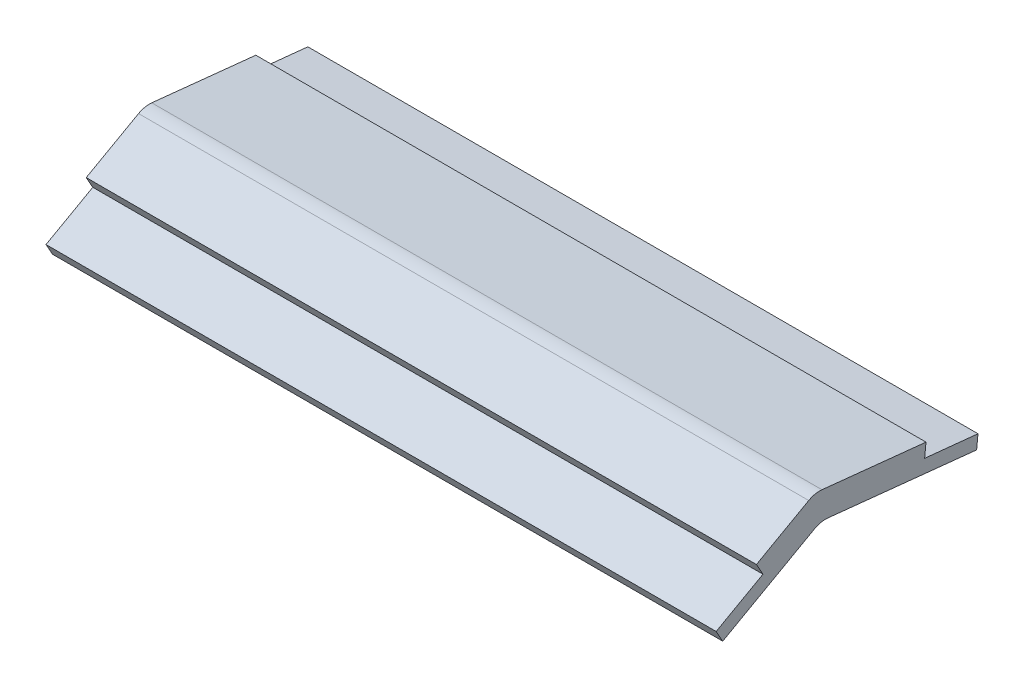
ISO-10303-21;
HEADER;
FILE_DESCRIPTION(('STEP AP214'),'2;1');
FILE_NAME('part.step','',(''),(''),'','','');
FILE_SCHEMA(('AUTOMOTIVE_DESIGN { 1 0 10303 214 1 1 1 1 }'));
ENDSEC;
DATA;
#1=APPLICATION_CONTEXT('core data for automotive mechanical design processes');
#2=APPLICATION_PROTOCOL_DEFINITION('international standard','automotive_design',2000,#1);
#3=PRODUCT_CONTEXT('',#1,'mechanical');
#4=PRODUCT('Part','Part','',(#3));
#5=PRODUCT_RELATED_PRODUCT_CATEGORY('part','',(#4));
#6=PRODUCT_DEFINITION_FORMATION('','',#4);
#7=PRODUCT_DEFINITION_CONTEXT('part definition',#1,'design');
#8=PRODUCT_DEFINITION('design','',#6,#7);
#9=PRODUCT_DEFINITION_SHAPE('','',#8);
#10=(LENGTH_UNIT() NAMED_UNIT(*) SI_UNIT(.MILLI.,.METRE.));
#11=(NAMED_UNIT(*) PLANE_ANGLE_UNIT() SI_UNIT($,.RADIAN.));
#12=(NAMED_UNIT(*) SI_UNIT($,.STERADIAN.) SOLID_ANGLE_UNIT());
#13=UNCERTAINTY_MEASURE_WITH_UNIT(LENGTH_MEASURE(1.E-05),#10,'distance_accuracy_value','');
#14=(GEOMETRIC_REPRESENTATION_CONTEXT(3) GLOBAL_UNCERTAINTY_ASSIGNED_CONTEXT((#13)) GLOBAL_UNIT_ASSIGNED_CONTEXT((#10,
#11,#12)) REPRESENTATION_CONTEXT('',''));
#15=CARTESIAN_POINT('',(0.,0.,0.));
#16=DIRECTION('',(0.,0.,1.));
#17=DIRECTION('',(1.,0.,0.));
#18=AXIS2_PLACEMENT_3D('',#15,#16,#17);
#19=CARTESIAN_POINT('',(150.,11.0948304798328,17.0451479877526));
#20=DIRECTION('',(0.,-0.872729204382896,-0.488204604461283));
#21=DIRECTION('',(0.,0.488204604461283,-0.872729204382896));
#22=AXIS2_PLACEMENT_3D('',#19,#20,#21);
#23=PLANE('',#22);
#24=DIRECTION('',(0.,-0.488204604461283,0.872729204382896));
#25=VECTOR('',#24,1.);
#26=CARTESIAN_POINT('',(0.,11.0948304798328,17.0451479877526));
#27=LINE('',#26,#25);
#28=CARTESIAN_POINT('',(0.,17.6447819354706,5.33625816903992));
#29=VERTEX_POINT('',#28);
#30=CARTESIAN_POINT('',(0.,11.0948304798328,17.0451479877526));
#31=VERTEX_POINT('',#30);
#32=EDGE_CURVE('E157',#29,#31,#27,.T.);
#33=ORIENTED_EDGE('',*,*,#32,.T.);
#34=DIRECTION('',(-1.,0.,0.));
#35=VECTOR('',#34,1.);
#36=CARTESIAN_POINT('',(150.,11.0948304798328,17.0451479877526));
#37=LINE('',#36,#35);
#38=CARTESIAN_POINT('',(150.,11.0948304798328,17.0451479877526));
#39=VERTEX_POINT('',#38);
#40=EDGE_CURVE('E11',#39,#31,#37,.T.);
#41=ORIENTED_EDGE('',*,*,#40,.F.);
#42=DIRECTION('',(0.,-0.488204604461283,0.872729204382896));
#43=VECTOR('',#42,1.);
#44=CARTESIAN_POINT('',(150.,11.0948304798328,17.0451479877526));
#45=LINE('',#44,#43);
#46=CARTESIAN_POINT('',(150.,17.6447819354706,5.33625816903992));
#47=VERTEX_POINT('',#46);
#48=EDGE_CURVE('E179',#47,#39,#45,.T.);
#49=ORIENTED_EDGE('',*,*,#48,.F.);
#50=DIRECTION('',(-1.,0.,0.));
#51=VECTOR('',#50,1.);
#52=CARTESIAN_POINT('',(150.,17.6447819354706,5.33625816903992));
#53=LINE('',#52,#51);
#54=EDGE_CURVE('E153',#47,#29,#53,.T.);
#55=ORIENTED_EDGE('',*,*,#54,.T.);
#56=EDGE_LOOP('',(#33,#41,#49,#55));
#57=FACE_BOUND('',#56,.T.);
#58=ADVANCED_FACE('F37',(#57),#23,.F.);
#59=CARTESIAN_POINT('',(150.,11.0948304798328,17.0451479877526));
#60=DIRECTION('',(0.,0.488204604461283,-0.872729204382896));
#61=DIRECTION('',(0.,0.872729204382896,0.488204604461283));
#62=AXIS2_PLACEMENT_3D('',#59,#60,#61);
#63=PLANE('',#62);
#64=DIRECTION('',(0.,-0.872729204382896,-0.488204604461283));
#65=VECTOR('',#64,1.);
#66=CARTESIAN_POINT('',(0.,11.0948304798328,17.0451479877526));
#67=LINE('',#66,#65);
#68=CARTESIAN_POINT('',(0.,8.47664286668409,15.5805341743687));
#69=VERTEX_POINT('',#68);
#70=EDGE_CURVE('E160',#31,#69,#67,.T.);
#71=ORIENTED_EDGE('',*,*,#70,.T.);
#72=DIRECTION('',(-1.,0.,0.));
#73=VECTOR('',#72,1.);
#74=CARTESIAN_POINT('',(150.,8.47664286668409,15.5805341743687));
#75=LINE('',#74,#73);
#76=CARTESIAN_POINT('',(150.,8.47664286668409,15.5805341743687));
#77=VERTEX_POINT('',#76);
#78=EDGE_CURVE('E45',#77,#69,#75,.T.);
#79=ORIENTED_EDGE('',*,*,#78,.F.);
#80=DIRECTION('',(0.,-0.872729204382896,-0.488204604461283));
#81=VECTOR('',#80,1.);
#82=CARTESIAN_POINT('',(150.,11.0948304798328,17.0451479877526));
#83=LINE('',#82,#81);
#84=EDGE_CURVE('E108',#39,#77,#83,.T.);
#85=ORIENTED_EDGE('',*,*,#84,.F.);
#86=ORIENTED_EDGE('',*,*,#40,.T.);
#87=EDGE_LOOP('',(#71,#79,#85,#86));
#88=FACE_BOUND('',#87,.T.);
#89=ADVANCED_FACE('F257',(#88),#63,.F.);
#90=CARTESIAN_POINT('',(150.,8.47664286668409,15.5805341743687));
#91=DIRECTION('',(0.,-0.872729204382896,-0.488204604461283));
#92=DIRECTION('',(0.,0.488204604461283,-0.872729204382896));
#93=AXIS2_PLACEMENT_3D('',#90,#91,#92);
#94=PLANE('',#93);
#95=DIRECTION('',(0.,-0.488204604461283,0.872729204382896));
#96=VECTOR('',#95,1.);
#97=CARTESIAN_POINT('',(0.,8.47664286668409,15.5805341743687));
#98=LINE('',#97,#96);
#99=CARTESIAN_POINT('',(0.,2.61818761314869,26.0532846269635));
#100=VERTEX_POINT('',#99);
#101=EDGE_CURVE('E162',#69,#100,#98,.T.);
#102=ORIENTED_EDGE('',*,*,#101,.T.);
#103=DIRECTION('',(-1.,0.,0.));
#104=VECTOR('',#103,1.);
#105=CARTESIAN_POINT('',(150.,2.61818761314869,26.0532846269635));
#106=LINE('',#105,#104);
#107=CARTESIAN_POINT('',(150.,2.61818761314869,26.0532846269635));
#108=VERTEX_POINT('',#107);
#109=EDGE_CURVE('E198',#108,#100,#106,.T.);
#110=ORIENTED_EDGE('',*,*,#109,.F.);
#111=DIRECTION('',(0.,-0.488204604461283,0.872729204382896));
#112=VECTOR('',#111,1.);
#113=CARTESIAN_POINT('',(150.,8.47664286668409,15.5805341743687));
#114=LINE('',#113,#112);
#115=EDGE_CURVE('E206',#77,#108,#114,.T.);
#116=ORIENTED_EDGE('',*,*,#115,.F.);
#117=ORIENTED_EDGE('',*,*,#78,.T.);
#118=EDGE_LOOP('',(#102,#110,#116,#117));
#119=FACE_BOUND('',#118,.T.);
#120=ADVANCED_FACE('F204',(#119),#94,.F.);
#121=CARTESIAN_POINT('',(150.,2.61818761314869,26.0532846269635));
#122=DIRECTION('',(0.,0.488204604461274,-0.872729204382901));
#123=DIRECTION('',(0.,0.872729204382901,0.488204604461274));
#124=AXIS2_PLACEMENT_3D('',#121,#122,#123);
#125=PLANE('',#124);
#126=DIRECTION('',(0.,-0.872729204382901,-0.488204604461274));
#127=VECTOR('',#126,1.);
#128=CARTESIAN_POINT('',(0.,2.61818761314869,26.0532846269635));
#129=LINE('',#128,#127);
#130=CARTESIAN_POINT('',(0.,0.,24.5886708135796));
#131=VERTEX_POINT('',#130);
#132=EDGE_CURVE('E164',#100,#131,#129,.T.);
#133=ORIENTED_EDGE('',*,*,#132,.T.);
#134=DIRECTION('',(-1.,0.,0.));
#135=VECTOR('',#134,1.);
#136=CARTESIAN_POINT('',(150.,0.,24.5886708135796));
#137=LINE('',#136,#135);
#138=CARTESIAN_POINT('',(150.,0.,24.5886708135796));
#139=VERTEX_POINT('',#138);
#140=EDGE_CURVE('E195',#139,#131,#137,.T.);
#141=ORIENTED_EDGE('',*,*,#140,.F.);
#142=DIRECTION('',(0.,-0.872729204382901,-0.488204604461274));
#143=VECTOR('',#142,1.);
#144=CARTESIAN_POINT('',(150.,2.61818761314869,26.0532846269635));
#145=LINE('',#144,#143);
#146=EDGE_CURVE('E224',#108,#139,#145,.T.);
#147=ORIENTED_EDGE('',*,*,#146,.F.);
#148=ORIENTED_EDGE('',*,*,#109,.T.);
#149=EDGE_LOOP('',(#133,#141,#147,#148));
#150=FACE_BOUND('',#149,.T.);
#151=ADVANCED_FACE('F215',(#150),#125,.F.);
#152=CARTESIAN_POINT('',(150.,0.,24.5886708135796));
#153=DIRECTION('',(0.,0.872729204382896,0.488204604461283));
#154=DIRECTION('',(0.,-0.488204604461283,0.872729204382896));
#155=AXIS2_PLACEMENT_3D('',#152,#153,#154);
#156=PLANE('',#155);
#157=DIRECTION('',(0.,0.488204604461283,-0.872729204382896));
#158=VECTOR('',#157,1.);
#159=CARTESIAN_POINT('',(0.,0.,24.5886708135796));
#160=LINE('',#159,#158);
#161=CARTESIAN_POINT('',(0.,11.5069491338813,4.01850316108857));
#162=VERTEX_POINT('',#161);
#163=EDGE_CURVE('E166',#131,#162,#160,.T.);
#164=ORIENTED_EDGE('',*,*,#163,.T.);
#165=DIRECTION('',(-1.,0.,0.));
#166=VECTOR('',#165,1.);
#167=CARTESIAN_POINT('',(150.,11.5069491338813,4.01850316108857));
#168=LINE('',#167,#166);
#169=CARTESIAN_POINT('',(150.,11.5069491338813,4.01850316108857));
#170=VERTEX_POINT('',#169);
#171=EDGE_CURVE('E192',#170,#162,#168,.T.);
#172=ORIENTED_EDGE('',*,*,#171,.F.);
#173=DIRECTION('',(0.,0.488204604461283,-0.872729204382896));
#174=VECTOR('',#173,1.);
#175=CARTESIAN_POINT('',(150.,0.,24.5886708135796));
#176=LINE('',#175,#174);
#177=EDGE_CURVE('E221',#139,#170,#176,.T.);
#178=ORIENTED_EDGE('',*,*,#177,.F.);
#179=ORIENTED_EDGE('',*,*,#140,.T.);
#180=EDGE_LOOP('',(#164,#172,#178,#179));
#181=FACE_BOUND('',#180,.T.);
#182=ADVANCED_FACE('F219',(#181),#156,.F.);
#183=CARTESIAN_POINT('',(150.,7.14330311196677,1.57748013878215));
#184=DIRECTION('',(-1.,0.,0.));
#185=DIRECTION('',(0.,0.,1.));
#186=AXIS2_PLACEMENT_3D('',#183,#184,#185);
#187=CYLINDRICAL_SURFACE('',#186,5.00000000000006);
#188=CARTESIAN_POINT('',(0.,7.14330311196677,1.57748013878215));
#189=DIRECTION('',(-1.,0.,0.));
#190=DIRECTION('',(0.,0.,-1.));
#191=AXIS2_PLACEMENT_3D('',#188,#189,#190);
#192=CIRCLE('',#191,5.00000000000006);
#193=CARTESIAN_POINT('',(0.,12.1165898361456,1.06132206308532));
#194=VERTEX_POINT('',#193);
#195=EDGE_CURVE('E168',#162,#194,#192,.T.);
#196=ORIENTED_EDGE('',*,*,#195,.T.);
#197=DIRECTION('',(-1.,0.,0.));
#198=VECTOR('',#197,1.);
#199=CARTESIAN_POINT('',(150.,12.1165898361456,1.06132206308532));
#200=LINE('',#199,#198);
#201=CARTESIAN_POINT('',(150.,12.1165898361456,1.06132206308532));
#202=VERTEX_POINT('',#201);
#203=EDGE_CURVE('E189',#202,#194,#200,.T.);
#204=ORIENTED_EDGE('',*,*,#203,.F.);
#205=CARTESIAN_POINT('',(150.,7.14330311196677,1.57748013878215));
#206=DIRECTION('',(-1.,0.,0.));
#207=DIRECTION('',(0.,0.,-1.));
#208=AXIS2_PLACEMENT_3D('',#205,#206,#207);
#209=CIRCLE('',#208,5.00000000000006);
#210=EDGE_CURVE('E223',#170,#202,#209,.T.);
#211=ORIENTED_EDGE('',*,*,#210,.F.);
#212=ORIENTED_EDGE('',*,*,#171,.T.);
#213=EDGE_LOOP('',(#196,#204,#211,#212));
#214=FACE_BOUND('',#213,.T.);
#215=ADVANCED_FACE('F270',(#214),#187,.F.);
#216=CARTESIAN_POINT('',(150.,12.1165898361456,1.06132206308532));
#217=DIRECTION('',(0.,0.994657344835757,-0.103231615139367));
#218=DIRECTION('',(0.,0.103231615139367,0.994657344835757));
#219=AXIS2_PLACEMENT_3D('',#216,#217,#218);
#220=PLANE('',#219);
#221=DIRECTION('',(0.,-0.103231615139367,-0.994657344835757));
#222=VECTOR('',#221,1.);
#223=CARTESIAN_POINT('',(0.,12.1165898361456,1.06132206308532));
#224=LINE('',#223,#222);
#225=CARTESIAN_POINT('',(0.,8.66041814032255,-32.2395863613621));
#226=VERTEX_POINT('',#225);
#227=EDGE_CURVE('E170',#194,#226,#224,.T.);
#228=ORIENTED_EDGE('',*,*,#227,.T.);
#229=DIRECTION('',(-1.,0.,0.));
#230=VECTOR('',#229,1.);
#231=CARTESIAN_POINT('',(150.,8.66041814032255,-32.2395863613621));
#232=LINE('',#231,#230);
#233=CARTESIAN_POINT('',(150.,8.66041814032255,-32.2395863613621));
#234=VERTEX_POINT('',#233);
#235=EDGE_CURVE('E186',#234,#226,#232,.T.);
#236=ORIENTED_EDGE('',*,*,#235,.F.);
#237=DIRECTION('',(0.,-0.103231615139367,-0.994657344835757));
#238=VECTOR('',#237,1.);
#239=CARTESIAN_POINT('',(150.,12.1165898361456,1.06132206308532));
#240=LINE('',#239,#238);
#241=EDGE_CURVE('E226',#202,#234,#240,.T.);
#242=ORIENTED_EDGE('',*,*,#241,.F.);
#243=ORIENTED_EDGE('',*,*,#203,.T.);
#244=EDGE_LOOP('',(#228,#236,#242,#243));
#245=FACE_BOUND('',#244,.T.);
#246=ADVANCED_FACE('F273',(#245),#220,.F.);
#247=CARTESIAN_POINT('',(150.,11.6443901748298,-32.5492812067802));
#248=DIRECTION('',(0.,0.103231615139368,0.994657344835757));
#249=DIRECTION('',(0.,-0.994657344835757,0.103231615139368));
#250=AXIS2_PLACEMENT_3D('',#247,#248,#249);
#251=PLANE('',#250);
#252=DIRECTION('',(0.,0.994657344835757,-0.103231615139368));
#253=VECTOR('',#252,1.);
#254=CARTESIAN_POINT('',(0.,11.6443901748298,-32.5492812067802));
#255=LINE('',#254,#253);
#256=CARTESIAN_POINT('',(0.,11.6443901748298,-32.5492812067802));
#257=VERTEX_POINT('',#256);
#258=EDGE_CURVE('E172',#226,#257,#255,.T.);
#259=ORIENTED_EDGE('',*,*,#258,.T.);
#260=DIRECTION('',(-1.,0.,0.));
#261=VECTOR('',#260,1.);
#262=CARTESIAN_POINT('',(150.,11.6443901748298,-32.5492812067802));
#263=LINE('',#262,#261);
#264=CARTESIAN_POINT('',(150.,11.6443901748298,-32.5492812067802));
#265=VERTEX_POINT('',#264);
#266=EDGE_CURVE('E183',#265,#257,#263,.T.);
#267=ORIENTED_EDGE('',*,*,#266,.F.);
#268=DIRECTION('',(0.,0.994657344835757,-0.103231615139368));
#269=VECTOR('',#268,1.);
#270=CARTESIAN_POINT('',(150.,11.6443901748298,-32.5492812067802));
#271=LINE('',#270,#269);
#272=EDGE_CURVE('E232',#234,#265,#271,.T.);
#273=ORIENTED_EDGE('',*,*,#272,.F.);
#274=ORIENTED_EDGE('',*,*,#235,.T.);
#275=EDGE_LOOP('',(#259,#267,#273,#274));
#276=FACE_BOUND('',#275,.T.);
#277=ADVANCED_FACE('F238',(#276),#251,.F.);
#278=CARTESIAN_POINT('',(150.,12.8523474609138,-20.6102343773638));
#279=DIRECTION('',(0.,-0.99492056911803,0.100663107173661));
#280=DIRECTION('',(0.,-0.100663107173661,-0.99492056911803));
#281=AXIS2_PLACEMENT_3D('',#278,#279,#280);
#282=PLANE('',#281);
#283=DIRECTION('',(0.,0.100663107173661,0.99492056911803));
#284=VECTOR('',#283,1.);
#285=CARTESIAN_POINT('',(0.,12.8523474609138,-20.6102343773638));
#286=LINE('',#285,#284);
#287=CARTESIAN_POINT('',(0.,12.8523474609138,-20.6102343773638));
#288=VERTEX_POINT('',#287);
#289=EDGE_CURVE('E174',#257,#288,#286,.T.);
#290=ORIENTED_EDGE('',*,*,#289,.T.);
#291=DIRECTION('',(-1.,0.,0.));
#292=VECTOR('',#291,1.);
#293=CARTESIAN_POINT('',(150.,12.8523474609138,-20.6102343773638));
#294=LINE('',#293,#292);
#295=CARTESIAN_POINT('',(150.,12.8523474609138,-20.6102343773638));
#296=VERTEX_POINT('',#295);
#297=EDGE_CURVE('E148',#296,#288,#294,.T.);
#298=ORIENTED_EDGE('',*,*,#297,.F.);
#299=DIRECTION('',(0.,0.100663107173661,0.99492056911803));
#300=VECTOR('',#299,1.);
#301=CARTESIAN_POINT('',(150.,12.8523474609138,-20.6102343773638));
#302=LINE('',#301,#300);
#303=EDGE_CURVE('E139',#265,#296,#302,.T.);
#304=ORIENTED_EDGE('',*,*,#303,.F.);
#305=ORIENTED_EDGE('',*,*,#266,.T.);
#306=EDGE_LOOP('',(#290,#298,#304,#305));
#307=FACE_BOUND('',#306,.T.);
#308=ADVANCED_FACE('F242',(#307),#282,.F.);
#309=CARTESIAN_POINT('',(150.,15.8371091682678,-20.9122236988848));
#310=DIRECTION('',(0.,0.100663107173661,0.99492056911803));
#311=DIRECTION('',(0.,-0.99492056911803,0.100663107173661));
#312=AXIS2_PLACEMENT_3D('',#309,#310,#311);
#313=PLANE('',#312);
#314=DIRECTION('',(0.,0.99492056911803,-0.100663107173661));
#315=VECTOR('',#314,1.);
#316=CARTESIAN_POINT('',(0.,15.8371091682678,-20.9122236988848));
#317=LINE('',#316,#315);
#318=CARTESIAN_POINT('',(0.,15.8371091682678,-20.9122236988848));
#319=VERTEX_POINT('',#318);
#320=EDGE_CURVE('E147',#288,#319,#317,.T.);
#321=ORIENTED_EDGE('',*,*,#320,.T.);
#322=DIRECTION('',(-1.,0.,0.));
#323=VECTOR('',#322,1.);
#324=CARTESIAN_POINT('',(150.,15.8371091682678,-20.9122236988848));
#325=LINE('',#324,#323);
#326=CARTESIAN_POINT('',(150.,15.8371091682678,-20.9122236988848));
#327=VERTEX_POINT('',#326);
#328=EDGE_CURVE('E144',#327,#319,#325,.T.);
#329=ORIENTED_EDGE('',*,*,#328,.F.);
#330=DIRECTION('',(0.,0.99492056911803,-0.100663107173661));
#331=VECTOR('',#330,1.);
#332=CARTESIAN_POINT('',(150.,15.8371091682678,-20.9122236988848));
#333=LINE('',#332,#331);
#334=EDGE_CURVE('E133',#296,#327,#333,.T.);
#335=ORIENTED_EDGE('',*,*,#334,.F.);
#336=ORIENTED_EDGE('',*,*,#297,.T.);
#337=EDGE_LOOP('',(#321,#329,#335,#336));
#338=FACE_BOUND('',#337,.T.);
#339=ADVANCED_FACE('F145',(#338),#313,.F.);
#340=CARTESIAN_POINT('',(150.,18.2544226377349,2.37907707103666));
#341=DIRECTION('',(0.,-0.994657344835757,0.103231615139367));
#342=DIRECTION('',(0.,-0.103231615139367,-0.994657344835757));
#343=AXIS2_PLACEMENT_3D('',#340,#341,#342);
#344=PLANE('',#343);
#345=DIRECTION('',(0.,0.103231615139367,0.994657344835757));
#346=VECTOR('',#345,1.);
#347=CARTESIAN_POINT('',(0.,18.2544226377349,2.37907707103666));
#348=LINE('',#347,#346);
#349=CARTESIAN_POINT('',(0.,18.2544226377349,2.37907707103666));
#350=VERTEX_POINT('',#349);
#351=EDGE_CURVE('E94',#319,#350,#348,.T.);
#352=ORIENTED_EDGE('',*,*,#351,.T.);
#353=DIRECTION('',(-1.,0.,0.));
#354=VECTOR('',#353,1.);
#355=CARTESIAN_POINT('',(150.,18.2544226377349,2.37907707103666));
#356=LINE('',#355,#354);
#357=CARTESIAN_POINT('',(150.,18.2544226377349,2.37907707103666));
#358=VERTEX_POINT('',#357);
#359=EDGE_CURVE('E149',#358,#350,#356,.T.);
#360=ORIENTED_EDGE('',*,*,#359,.F.);
#361=DIRECTION('',(0.,0.103231615139367,0.994657344835757));
#362=VECTOR('',#361,1.);
#363=CARTESIAN_POINT('',(150.,18.2544226377349,2.37907707103666));
#364=LINE('',#363,#362);
#365=EDGE_CURVE('E137',#327,#358,#364,.T.);
#366=ORIENTED_EDGE('',*,*,#365,.F.);
#367=ORIENTED_EDGE('',*,*,#328,.T.);
#368=EDGE_LOOP('',(#352,#360,#366,#367));
#369=FACE_BOUND('',#368,.T.);
#370=ADVANCED_FACE('F151',(#369),#344,.F.);
#371=CARTESIAN_POINT('',(150.,13.281135913556,2.89523514673351));
#372=DIRECTION('',(-1.,0.,0.));
#373=DIRECTION('',(0.,0.,1.));
#374=AXIS2_PLACEMENT_3D('',#371,#372,#373);
#375=CYLINDRICAL_SURFACE('',#374,5.00000000000006);
#376=CARTESIAN_POINT('',(0.,13.281135913556,2.89523514673351));
#377=DIRECTION('',(1.,0.,0.));
#378=DIRECTION('',(0.,0.,-1.));
#379=AXIS2_PLACEMENT_3D('',#376,#377,#378);
#380=CIRCLE('',#379,5.00000000000006);
#381=EDGE_CURVE('E100',#350,#29,#380,.T.);
#382=ORIENTED_EDGE('',*,*,#381,.T.);
#383=ORIENTED_EDGE('',*,*,#54,.F.);
#384=CARTESIAN_POINT('',(150.,13.281135913556,2.89523514673351));
#385=DIRECTION('',(1.,0.,0.));
#386=DIRECTION('',(0.,0.,-1.));
#387=AXIS2_PLACEMENT_3D('',#384,#385,#386);
#388=CIRCLE('',#387,5.00000000000006);
#389=EDGE_CURVE('E53',#358,#47,#388,.T.);
#390=ORIENTED_EDGE('',*,*,#389,.F.);
#391=ORIENTED_EDGE('',*,*,#359,.T.);
#392=EDGE_LOOP('',(#382,#383,#390,#391));
#393=FACE_BOUND('',#392,.T.);
#394=ADVANCED_FACE('F246',(#393),#375,.T.);
#395=CARTESIAN_POINT('',(150.,13.281135913556,2.89523514673351));
#396=DIRECTION('',(1.,0.,0.));
#397=DIRECTION('',(0.,0.,-1.));
#398=AXIS2_PLACEMENT_3D('',#395,#396,#397);
#399=PLANE('',#398);
#400=ORIENTED_EDGE('',*,*,#48,.T.);
#401=ORIENTED_EDGE('',*,*,#84,.T.);
#402=ORIENTED_EDGE('',*,*,#115,.T.);
#403=ORIENTED_EDGE('',*,*,#146,.T.);
#404=ORIENTED_EDGE('',*,*,#177,.T.);
#405=ORIENTED_EDGE('',*,*,#210,.T.);
#406=ORIENTED_EDGE('',*,*,#241,.T.);
#407=ORIENTED_EDGE('',*,*,#272,.T.);
#408=ORIENTED_EDGE('',*,*,#303,.T.);
#409=ORIENTED_EDGE('',*,*,#334,.T.);
#410=ORIENTED_EDGE('',*,*,#365,.T.);
#411=ORIENTED_EDGE('',*,*,#389,.T.);
#412=EDGE_LOOP('',(#400,#401,#402,#403,#404,#405,#406,#407,#408,#409,#410,#411));
#413=FACE_BOUND('',#412,.T.);
#414=ADVANCED_FACE('F135',(#413),#399,.T.);
#415=CARTESIAN_POINT('',(0.,13.281135913556,2.89523514673351));
#416=DIRECTION('',(1.,0.,0.));
#417=DIRECTION('',(0.,0.,-1.));
#418=AXIS2_PLACEMENT_3D('',#415,#416,#417);
#419=PLANE('',#418);
#420=ORIENTED_EDGE('',*,*,#32,.F.);
#421=ORIENTED_EDGE('',*,*,#381,.F.);
#422=ORIENTED_EDGE('',*,*,#351,.F.);
#423=ORIENTED_EDGE('',*,*,#320,.F.);
#424=ORIENTED_EDGE('',*,*,#289,.F.);
#425=ORIENTED_EDGE('',*,*,#258,.F.);
#426=ORIENTED_EDGE('',*,*,#227,.F.);
#427=ORIENTED_EDGE('',*,*,#195,.F.);
#428=ORIENTED_EDGE('',*,*,#163,.F.);
#429=ORIENTED_EDGE('',*,*,#132,.F.);
#430=ORIENTED_EDGE('',*,*,#101,.F.);
#431=ORIENTED_EDGE('',*,*,#70,.F.);
#432=EDGE_LOOP('',(#420,#421,#422,#423,#424,#425,#426,#427,#428,#429,#430,#431));
#433=FACE_BOUND('',#432,.T.);
#434=ADVANCED_FACE('F210',(#433),#419,.F.);
#435=CLOSED_SHELL('',(#58,#89,#120,#151,#182,#215,#246,#277,#308,#339,#370,#394,#414,#434));
#436=MANIFOLD_SOLID_BREP('B2',#435);
#437=ADVANCED_BREP_SHAPE_REPRESENTATION('',(#18,#436),#14);
#438=SHAPE_DEFINITION_REPRESENTATION(#9,#437);
ENDSEC;
END-ISO-10303-21;
